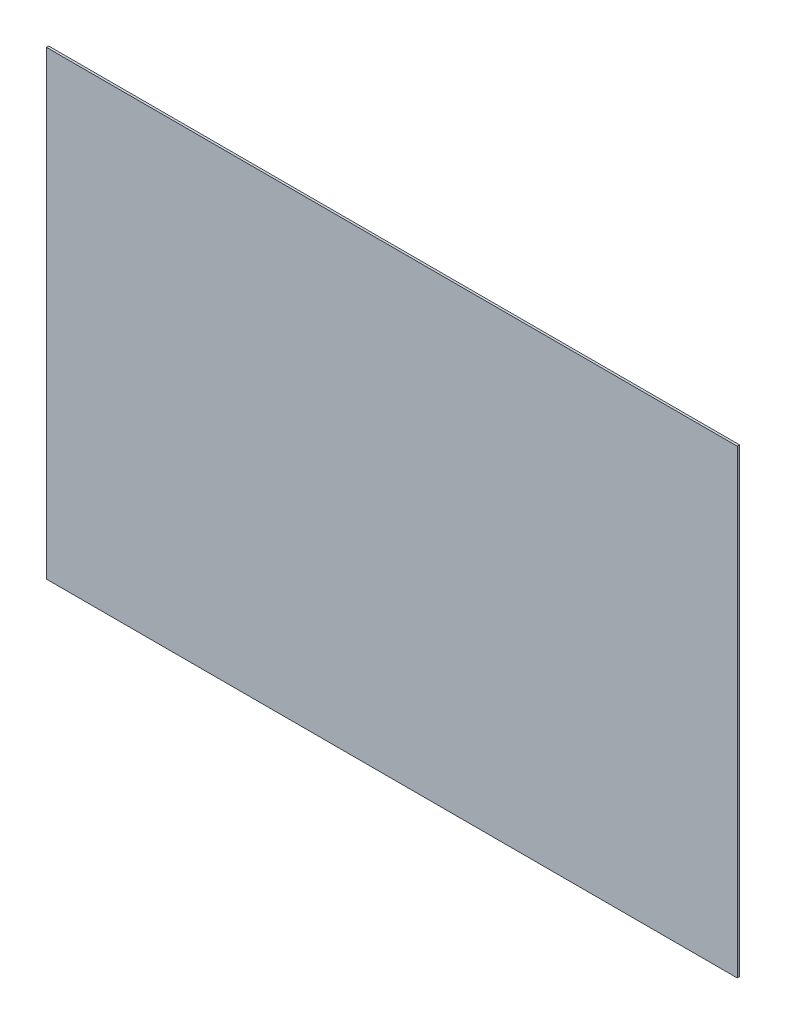
ISO-10303-21;
HEADER;
FILE_DESCRIPTION(('STEP AP214'),'2;1');
FILE_NAME('part.step','',(''),(''),'','','');
FILE_SCHEMA(('AUTOMOTIVE_DESIGN { 1 0 10303 214 1 1 1 1 }'));
ENDSEC;
DATA;
#1=APPLICATION_CONTEXT('core data for automotive mechanical design processes');
#2=APPLICATION_PROTOCOL_DEFINITION('international standard','automotive_design',2000,#1);
#3=PRODUCT_CONTEXT('',#1,'mechanical');
#4=PRODUCT('Part','Part','',(#3));
#5=PRODUCT_RELATED_PRODUCT_CATEGORY('part','',(#4));
#6=PRODUCT_DEFINITION_FORMATION('','',#4);
#7=PRODUCT_DEFINITION_CONTEXT('part definition',#1,'design');
#8=PRODUCT_DEFINITION('design','',#6,#7);
#9=PRODUCT_DEFINITION_SHAPE('','',#8);
#10=(LENGTH_UNIT() NAMED_UNIT(*) SI_UNIT(.MILLI.,.METRE.));
#11=(NAMED_UNIT(*) PLANE_ANGLE_UNIT() SI_UNIT($,.RADIAN.));
#12=(NAMED_UNIT(*) SI_UNIT($,.STERADIAN.) SOLID_ANGLE_UNIT());
#13=UNCERTAINTY_MEASURE_WITH_UNIT(LENGTH_MEASURE(1.E-05),#10,'distance_accuracy_value','');
#14=(GEOMETRIC_REPRESENTATION_CONTEXT(3) GLOBAL_UNCERTAINTY_ASSIGNED_CONTEXT((#13)) GLOBAL_UNIT_ASSIGNED_CONTEXT((#10,
#11,#12)) REPRESENTATION_CONTEXT('',''));
#15=CARTESIAN_POINT('',(0.,0.,0.));
#16=DIRECTION('',(0.,0.,1.));
#17=DIRECTION('',(1.,0.,0.));
#18=AXIS2_PLACEMENT_3D('',#15,#16,#17);
#19=CARTESIAN_POINT('',(150.,100.,1.));
#20=DIRECTION('',(-1.,0.,0.));
#21=DIRECTION('',(0.,0.,1.));
#22=AXIS2_PLACEMENT_3D('',#19,#20,#21);
#23=PLANE('',#22);
#24=DIRECTION('',(0.,1.,0.));
#25=VECTOR('',#24,1.);
#26=CARTESIAN_POINT('',(150.,100.,0.));
#27=LINE('',#26,#25);
#28=CARTESIAN_POINT('',(150.,-100.,0.));
#29=VERTEX_POINT('',#28);
#30=CARTESIAN_POINT('',(150.,100.,0.));
#31=VERTEX_POINT('',#30);
#32=EDGE_CURVE('E99',#29,#31,#27,.T.);
#33=ORIENTED_EDGE('',*,*,#32,.T.);
#34=DIRECTION('',(0.,0.,-1.));
#35=VECTOR('',#34,1.);
#36=CARTESIAN_POINT('',(150.,100.,1.));
#37=LINE('',#36,#35);
#38=CARTESIAN_POINT('',(150.,100.,1.));
#39=VERTEX_POINT('',#38);
#40=EDGE_CURVE('E11',#39,#31,#37,.T.);
#41=ORIENTED_EDGE('',*,*,#40,.F.);
#42=DIRECTION('',(0.,1.,0.));
#43=VECTOR('',#42,1.);
#44=CARTESIAN_POINT('',(150.,100.,1.));
#45=LINE('',#44,#43);
#46=CARTESIAN_POINT('',(150.,-100.,1.));
#47=VERTEX_POINT('',#46);
#48=EDGE_CURVE('E87',#47,#39,#45,.T.);
#49=ORIENTED_EDGE('',*,*,#48,.F.);
#50=DIRECTION('',(0.,0.,-1.));
#51=VECTOR('',#50,1.);
#52=CARTESIAN_POINT('',(150.,-100.,1.));
#53=LINE('',#52,#51);
#54=EDGE_CURVE('E95',#47,#29,#53,.T.);
#55=ORIENTED_EDGE('',*,*,#54,.T.);
#56=EDGE_LOOP('',(#33,#41,#49,#55));
#57=FACE_BOUND('',#56,.T.);
#58=ADVANCED_FACE('F36',(#57),#23,.F.);
#59=CARTESIAN_POINT('',(-150.,100.,1.));
#60=DIRECTION('',(0.,-1.,0.));
#61=DIRECTION('',(0.,0.,-1.));
#62=AXIS2_PLACEMENT_3D('',#59,#60,#61);
#63=PLANE('',#62);
#64=DIRECTION('',(-1.,0.,0.));
#65=VECTOR('',#64,1.);
#66=CARTESIAN_POINT('',(-150.,100.,0.));
#67=LINE('',#66,#65);
#68=CARTESIAN_POINT('',(-150.,100.,0.));
#69=VERTEX_POINT('',#68);
#70=EDGE_CURVE('E91',#31,#69,#67,.T.);
#71=ORIENTED_EDGE('',*,*,#70,.T.);
#72=DIRECTION('',(0.,0.,-1.));
#73=VECTOR('',#72,1.);
#74=CARTESIAN_POINT('',(-150.,100.,1.));
#75=LINE('',#74,#73);
#76=CARTESIAN_POINT('',(-150.,100.,1.));
#77=VERTEX_POINT('',#76);
#78=EDGE_CURVE('E44',#77,#69,#75,.T.);
#79=ORIENTED_EDGE('',*,*,#78,.F.);
#80=DIRECTION('',(-1.,0.,0.));
#81=VECTOR('',#80,1.);
#82=CARTESIAN_POINT('',(-150.,100.,1.));
#83=LINE('',#82,#81);
#84=EDGE_CURVE('E82',#39,#77,#83,.T.);
#85=ORIENTED_EDGE('',*,*,#84,.F.);
#86=ORIENTED_EDGE('',*,*,#40,.T.);
#87=EDGE_LOOP('',(#71,#79,#85,#86));
#88=FACE_BOUND('',#87,.T.);
#89=ADVANCED_FACE('F90',(#88),#63,.F.);
#90=CARTESIAN_POINT('',(-150.,100.,1.));
#91=DIRECTION('',(1.,0.,0.));
#92=DIRECTION('',(0.,0.,-1.));
#93=AXIS2_PLACEMENT_3D('',#90,#91,#92);
#94=PLANE('',#93);
#95=DIRECTION('',(0.,-1.,0.));
#96=VECTOR('',#95,1.);
#97=CARTESIAN_POINT('',(-150.,100.,0.));
#98=LINE('',#97,#96);
#99=CARTESIAN_POINT('',(-150.,-100.,0.));
#100=VERTEX_POINT('',#99);
#101=EDGE_CURVE('E69',#69,#100,#98,.T.);
#102=ORIENTED_EDGE('',*,*,#101,.T.);
#103=DIRECTION('',(0.,0.,-1.));
#104=VECTOR('',#103,1.);
#105=CARTESIAN_POINT('',(-150.,-100.,1.));
#106=LINE('',#105,#104);
#107=CARTESIAN_POINT('',(-150.,-100.,1.));
#108=VERTEX_POINT('',#107);
#109=EDGE_CURVE('E92',#108,#100,#106,.T.);
#110=ORIENTED_EDGE('',*,*,#109,.F.);
#111=DIRECTION('',(0.,-1.,0.));
#112=VECTOR('',#111,1.);
#113=CARTESIAN_POINT('',(-150.,100.,1.));
#114=LINE('',#113,#112);
#115=EDGE_CURVE('E85',#77,#108,#114,.T.);
#116=ORIENTED_EDGE('',*,*,#115,.F.);
#117=ORIENTED_EDGE('',*,*,#78,.T.);
#118=EDGE_LOOP('',(#102,#110,#116,#117));
#119=FACE_BOUND('',#118,.T.);
#120=ADVANCED_FACE('F93',(#119),#94,.F.);
#121=CARTESIAN_POINT('',(-150.,-100.,1.));
#122=DIRECTION('',(0.,1.,0.));
#123=DIRECTION('',(0.,0.,1.));
#124=AXIS2_PLACEMENT_3D('',#121,#122,#123);
#125=PLANE('',#124);
#126=DIRECTION('',(1.,0.,0.));
#127=VECTOR('',#126,1.);
#128=CARTESIAN_POINT('',(-150.,-100.,0.));
#129=LINE('',#128,#127);
#130=EDGE_CURVE('E75',#100,#29,#129,.T.);
#131=ORIENTED_EDGE('',*,*,#130,.T.);
#132=ORIENTED_EDGE('',*,*,#54,.F.);
#133=DIRECTION('',(1.,0.,0.));
#134=VECTOR('',#133,1.);
#135=CARTESIAN_POINT('',(-150.,-100.,1.));
#136=LINE('',#135,#134);
#137=EDGE_CURVE('E52',#108,#47,#136,.T.);
#138=ORIENTED_EDGE('',*,*,#137,.F.);
#139=ORIENTED_EDGE('',*,*,#109,.T.);
#140=EDGE_LOOP('',(#131,#132,#138,#139));
#141=FACE_BOUND('',#140,.T.);
#142=ADVANCED_FACE('F106',(#141),#125,.F.);
#143=CARTESIAN_POINT('',(0.,0.,1.));
#144=DIRECTION('',(0.,0.,1.));
#145=DIRECTION('',(1.,0.,0.));
#146=AXIS2_PLACEMENT_3D('',#143,#144,#145);
#147=PLANE('',#146);
#148=ORIENTED_EDGE('',*,*,#48,.T.);
#149=ORIENTED_EDGE('',*,*,#84,.T.);
#150=ORIENTED_EDGE('',*,*,#115,.T.);
#151=ORIENTED_EDGE('',*,*,#137,.T.);
#152=EDGE_LOOP('',(#148,#149,#150,#151));
#153=FACE_BOUND('',#152,.T.);
#154=ADVANCED_FACE('F83',(#153),#147,.T.);
#155=CARTESIAN_POINT('',(0.,0.,0.));
#156=DIRECTION('',(0.,0.,1.));
#157=DIRECTION('',(1.,0.,0.));
#158=AXIS2_PLACEMENT_3D('',#155,#156,#157);
#159=PLANE('',#158);
#160=ORIENTED_EDGE('',*,*,#32,.F.);
#161=ORIENTED_EDGE('',*,*,#130,.F.);
#162=ORIENTED_EDGE('',*,*,#101,.F.);
#163=ORIENTED_EDGE('',*,*,#70,.F.);
#164=EDGE_LOOP('',(#160,#161,#162,#163));
#165=FACE_BOUND('',#164,.T.);
#166=ADVANCED_FACE('F109',(#165),#159,.F.);
#167=CLOSED_SHELL('',(#58,#89,#120,#142,#154,#166));
#168=MANIFOLD_SOLID_BREP('B2',#167);
#169=ADVANCED_BREP_SHAPE_REPRESENTATION('',(#18,#168),#14);
#170=SHAPE_DEFINITION_REPRESENTATION(#9,#169);
ENDSEC;
END-ISO-10303-21;
